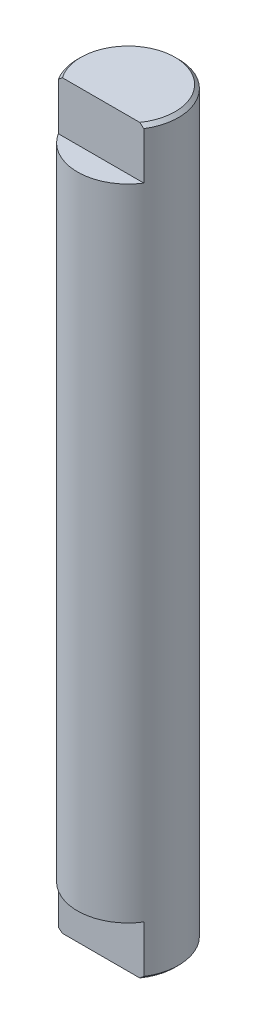
ISO-10303-21;
HEADER;
FILE_DESCRIPTION(('STEP AP214'),'2;1');
FILE_NAME('part.step','',(''),(''),'','','');
FILE_SCHEMA(('AUTOMOTIVE_DESIGN { 1 0 10303 214 1 1 1 1 }'));
ENDSEC;
DATA;
#1=APPLICATION_CONTEXT('core data for automotive mechanical design processes');
#2=APPLICATION_PROTOCOL_DEFINITION('international standard','automotive_design',2000,#1);
#3=PRODUCT_CONTEXT('',#1,'mechanical');
#4=PRODUCT('Part','Part','',(#3));
#5=PRODUCT_RELATED_PRODUCT_CATEGORY('part','',(#4));
#6=PRODUCT_DEFINITION_FORMATION('','',#4);
#7=PRODUCT_DEFINITION_CONTEXT('part definition',#1,'design');
#8=PRODUCT_DEFINITION('design','',#6,#7);
#9=PRODUCT_DEFINITION_SHAPE('','',#8);
#10=(LENGTH_UNIT() NAMED_UNIT(*) SI_UNIT(.MILLI.,.METRE.));
#11=(NAMED_UNIT(*) PLANE_ANGLE_UNIT() SI_UNIT($,.RADIAN.));
#12=(NAMED_UNIT(*) SI_UNIT($,.STERADIAN.) SOLID_ANGLE_UNIT());
#13=UNCERTAINTY_MEASURE_WITH_UNIT(LENGTH_MEASURE(1.E-05),#10,'distance_accuracy_value','');
#14=(GEOMETRIC_REPRESENTATION_CONTEXT(3) GLOBAL_UNCERTAINTY_ASSIGNED_CONTEXT((#13)) GLOBAL_UNIT_ASSIGNED_CONTEXT((#10,
#11,#12)) REPRESENTATION_CONTEXT('',''));
#15=CARTESIAN_POINT('',(0.,0.,0.));
#16=DIRECTION('',(0.,0.,1.));
#17=DIRECTION('',(1.,0.,0.));
#18=AXIS2_PLACEMENT_3D('',#15,#16,#17);
#19=CARTESIAN_POINT('',(21.7578079285504,8.6872644172597,10.3999999999786));
#20=DIRECTION('',(0.,-1.,0.));
#21=DIRECTION('',(0.,0.,-1.));
#22=AXIS2_PLACEMENT_3D('',#19,#20,#21);
#23=CYLINDRICAL_SURFACE('',#22,1.5);
#24=DIRECTION('',(0.,-1.,0.));
#25=VECTOR('',#24,1.);
#26=CARTESIAN_POINT('',(23.0266656825954,-11.8127355827403,11.1999999999786));
#27=LINE('',#26,#25);
#28=CARTESIAN_POINT('',(23.0266656825954,-11.8127355827403,11.1999999999786));
#29=VERTEX_POINT('',#28);
#30=CARTESIAN_POINT('',(23.0266656825954,-13.2127355826565,11.1999999999786));
#31=VERTEX_POINT('',#30);
#32=EDGE_CURVE('E91',#29,#31,#27,.T.);
#33=ORIENTED_EDGE('',*,*,#32,.T.);
#34=CARTESIAN_POINT('',(21.7578079285504,-13.2127355826565,10.3999999999786));
#35=DIRECTION('',(0.,-1.,0.));
#36=DIRECTION('',(0.,0.,-1.));
#37=AXIS2_PLACEMENT_3D('',#34,#35,#36);
#38=CIRCLE('',#37,1.5);
#39=CARTESIAN_POINT('',(20.4889501745055,-13.2127355826565,11.1999999999786));
#40=VERTEX_POINT('',#39);
#41=EDGE_CURVE('E11',#31,#40,#38,.F.);
#42=ORIENTED_EDGE('',*,*,#41,.T.);
#43=DIRECTION('',(0.,-1.,0.));
#44=VECTOR('',#43,1.);
#45=CARTESIAN_POINT('',(20.4889501745055,-11.8127355827403,11.1999999999786));
#46=LINE('',#45,#44);
#47=CARTESIAN_POINT('',(20.4889501745055,-11.8127355827403,11.1999999999786));
#48=VERTEX_POINT('',#47);
#49=EDGE_CURVE('E89',#48,#40,#46,.T.);
#50=ORIENTED_EDGE('',*,*,#49,.F.);
#51=CARTESIAN_POINT('',(21.7578079285504,-11.8127355827403,10.3999999999786));
#52=DIRECTION('',(0.,-1.,0.));
#53=DIRECTION('',(0.,0.,-1.));
#54=AXIS2_PLACEMENT_3D('',#51,#52,#53);
#55=CIRCLE('',#54,1.5);
#56=EDGE_CURVE('E82',#29,#48,#55,.T.);
#57=ORIENTED_EDGE('',*,*,#56,.F.);
#58=EDGE_LOOP('',(#33,#42,#50,#57));
#59=FACE_BOUND('',#58,.T.);
#60=DIRECTION('',(0.,1.,0.));
#61=VECTOR('',#60,1.);
#62=CARTESIAN_POINT('',(20.4889501745055,7.1872644172597,11.1999999999786));
#63=LINE('',#62,#61);
#64=CARTESIAN_POINT('',(20.4889501745055,7.1872644172597,11.1999999999786));
#65=VERTEX_POINT('',#64);
#66=CARTESIAN_POINT('',(20.4889501745055,8.58726441724223,11.1999999999786));
#67=VERTEX_POINT('',#66);
#68=EDGE_CURVE('E107',#65,#67,#63,.T.);
#69=ORIENTED_EDGE('',*,*,#68,.T.);
#70=CARTESIAN_POINT('',(21.7578079285504,8.58726441724223,10.3999999999786));
#71=DIRECTION('',(0.,1.,0.));
#72=DIRECTION('',(0.,0.,1.));
#73=AXIS2_PLACEMENT_3D('',#70,#71,#72);
#74=CIRCLE('',#73,1.5);
#75=CARTESIAN_POINT('',(23.0266656825954,8.58726441724223,11.1999999999786));
#76=VERTEX_POINT('',#75);
#77=EDGE_CURVE('E110',#67,#76,#74,.F.);
#78=ORIENTED_EDGE('',*,*,#77,.T.);
#79=DIRECTION('',(0.,1.,0.));
#80=VECTOR('',#79,1.);
#81=CARTESIAN_POINT('',(23.0266656825954,7.1872644172597,11.1999999999786));
#82=LINE('',#81,#80);
#83=CARTESIAN_POINT('',(23.0266656825954,7.1872644172597,11.1999999999786));
#84=VERTEX_POINT('',#83);
#85=EDGE_CURVE('E104',#84,#76,#82,.T.);
#86=ORIENTED_EDGE('',*,*,#85,.F.);
#87=CARTESIAN_POINT('',(21.7578079285504,7.1872644172597,10.3999999999786));
#88=DIRECTION('',(0.,1.,0.));
#89=DIRECTION('',(0.,0.,1.));
#90=AXIS2_PLACEMENT_3D('',#87,#88,#89);
#91=CIRCLE('',#90,1.5);
#92=EDGE_CURVE('E99',#65,#84,#91,.T.);
#93=ORIENTED_EDGE('',*,*,#92,.F.);
#94=EDGE_LOOP('',(#69,#78,#86,#93));
#95=FACE_BOUND('',#94,.T.);
#96=ADVANCED_FACE('F30',(#59,#95),#23,.T.);
#97=CARTESIAN_POINT('',(23.2578079285504,8.6872644172597,10.3999999999786));
#98=DIRECTION('',(0.,1.,0.));
#99=DIRECTION('',(0.,0.,1.));
#100=AXIS2_PLACEMENT_3D('',#97,#98,#99);
#101=PLANE('',#100);
#102=DIRECTION('',(-1.,0.,0.));
#103=VECTOR('',#102,1.);
#104=CARTESIAN_POINT('',(23.0266656825954,8.6872644172597,11.1999999999786));
#105=LINE('',#104,#103);
#106=CARTESIAN_POINT('',(22.9067204578368,8.6872644172597,11.1999999999786));
#107=VERTEX_POINT('',#106);
#108=CARTESIAN_POINT('',(20.6088953992641,8.6872644172597,11.1999999999786));
#109=VERTEX_POINT('',#108);
#110=EDGE_CURVE('E95',#107,#109,#105,.T.);
#111=ORIENTED_EDGE('',*,*,#110,.F.);
#112=CARTESIAN_POINT('',(21.7578079285504,8.6872644172597,10.3999999999786));
#113=DIRECTION('',(0.,1.,0.));
#114=DIRECTION('',(0.,0.,1.));
#115=AXIS2_PLACEMENT_3D('',#112,#113,#114);
#116=CIRCLE('',#115,1.39999999998253);
#117=EDGE_CURVE('E215',#107,#109,#116,.T.);
#118=ORIENTED_EDGE('',*,*,#117,.T.);
#119=EDGE_LOOP('',(#111,#118));
#120=FACE_BOUND('',#119,.T.);
#121=ADVANCED_FACE('F141',(#120),#101,.T.);
#122=CARTESIAN_POINT('',(21.7578079285504,-13.3127355827403,10.3999999999786));
#123=DIRECTION('',(0.,-1.,0.));
#124=DIRECTION('',(0.,0.,-1.));
#125=AXIS2_PLACEMENT_3D('',#122,#123,#124);
#126=PLANE('',#125);
#127=DIRECTION('',(1.,0.,0.));
#128=VECTOR('',#127,1.);
#129=CARTESIAN_POINT('',(20.4889501745055,-13.3127355827403,11.1999999999786));
#130=LINE('',#129,#128);
#131=CARTESIAN_POINT('',(20.6088953992757,-13.3127355827403,11.1999999999786));
#132=VERTEX_POINT('',#131);
#133=CARTESIAN_POINT('',(22.9067204578252,-13.3127355827403,11.1999999999786));
#134=VERTEX_POINT('',#133);
#135=EDGE_CURVE('E86',#132,#134,#130,.T.);
#136=ORIENTED_EDGE('',*,*,#135,.F.);
#137=CARTESIAN_POINT('',(21.7578079285504,-13.3127355827403,10.3999999999786));
#138=DIRECTION('',(0.,-1.,0.));
#139=DIRECTION('',(0.,0.,-1.));
#140=AXIS2_PLACEMENT_3D('',#137,#138,#139);
#141=CIRCLE('',#140,1.39999999997304);
#142=EDGE_CURVE('E212',#132,#134,#141,.T.);
#143=ORIENTED_EDGE('',*,*,#142,.T.);
#144=EDGE_LOOP('',(#136,#143));
#145=FACE_BOUND('',#144,.T.);
#146=ADVANCED_FACE('F135',(#145),#126,.T.);
#147=CARTESIAN_POINT('',(23.0266656825954,7.1872644172597,11.1999999999786));
#148=DIRECTION('',(0.,0.,-1.));
#149=DIRECTION('',(-1.,0.,0.));
#150=AXIS2_PLACEMENT_3D('',#147,#148,#149);
#151=PLANE('',#150);
#152=ORIENTED_EDGE('',*,*,#85,.T.);
#153=CARTESIAN_POINT('',(23.0266656825954,8.58726441724223,11.1999999999786));
#154=CARTESIAN_POINT('',(23.0067988257606,8.60407981333087,11.1999999999786));
#155=CARTESIAN_POINT('',(22.9868699667476,8.62082084076762,11.1999999999786));
#156=CARTESIAN_POINT('',(22.9468882252797,8.65415417424878,11.1999999999786));
#157=CARTESIAN_POINT('',(22.9268353427066,8.67074648015118,11.1999999999786));
#158=CARTESIAN_POINT('',(22.9067204578368,8.6872644172597,11.1999999999786));
#159=B_SPLINE_CURVE_WITH_KNOTS('',3,(#153,#154,#155,#156,#157,#158),.UNSPECIFIED.,.F.,.F.,(4,2,
4),(0.,0.0780819620066894,0.156163998557068),.UNSPECIFIED.);
#160=EDGE_CURVE('E121',#76,#107,#159,.T.);
#161=ORIENTED_EDGE('',*,*,#160,.T.);
#162=ORIENTED_EDGE('',*,*,#110,.T.);
#163=CARTESIAN_POINT('',(20.6088953992641,8.6872644172597,11.1999999999786));
#164=CARTESIAN_POINT('',(20.5887805143943,8.67074648015118,11.1999999999786));
#165=CARTESIAN_POINT('',(20.5687276318211,8.65415417424878,11.1999999999786));
#166=CARTESIAN_POINT('',(20.5287458903533,8.62082084076762,11.1999999999786));
#167=CARTESIAN_POINT('',(20.5088170313402,8.60407981333087,11.1999999999786));
#168=CARTESIAN_POINT('',(20.4889501745055,8.58726441724223,11.1999999999786));
#169=B_SPLINE_CURVE_WITH_KNOTS('',3,(#163,#164,#165,#166,#167,#168),.UNSPECIFIED.,.F.,.F.,(4,2,
4),(0.,0.0780820365503797,0.156163998557069),.UNSPECIFIED.);
#170=EDGE_CURVE('E115',#109,#67,#169,.T.);
#171=ORIENTED_EDGE('',*,*,#170,.T.);
#172=ORIENTED_EDGE('',*,*,#68,.F.);
#173=DIRECTION('',(-1.,0.,0.));
#174=VECTOR('',#173,1.);
#175=CARTESIAN_POINT('',(23.0266656825954,7.1872644172597,11.1999999999786));
#176=LINE('',#175,#174);
#177=EDGE_CURVE('E101',#84,#65,#176,.T.);
#178=ORIENTED_EDGE('',*,*,#177,.F.);
#179=EDGE_LOOP('',(#152,#161,#162,#171,#172,#178));
#180=FACE_BOUND('',#179,.T.);
#181=ADVANCED_FACE('F129',(#180),#151,.F.);
#182=CARTESIAN_POINT('',(21.7578079285504,7.1872644172597,10.3999999999786));
#183=DIRECTION('',(0.,1.,0.));
#184=DIRECTION('',(0.,0.,1.));
#185=AXIS2_PLACEMENT_3D('',#182,#183,#184);
#186=PLANE('',#185);
#187=ORIENTED_EDGE('',*,*,#92,.T.);
#188=ORIENTED_EDGE('',*,*,#177,.T.);
#189=EDGE_LOOP('',(#187,#188));
#190=FACE_BOUND('',#189,.T.);
#191=ADVANCED_FACE('F134',(#190),#186,.T.);
#192=CARTESIAN_POINT('',(20.4889501745055,-11.8127355827403,11.1999999999786));
#193=DIRECTION('',(0.,0.,-1.));
#194=DIRECTION('',(-1.,0.,0.));
#195=AXIS2_PLACEMENT_3D('',#192,#193,#194);
#196=PLANE('',#195);
#197=ORIENTED_EDGE('',*,*,#135,.T.);
#198=CARTESIAN_POINT('',(22.9067204578252,-13.3127355827403,11.1999999999786));
#199=CARTESIAN_POINT('',(22.9268353426971,-13.2962176456208,11.1999999999786));
#200=CARTESIAN_POINT('',(22.9468882252722,-13.2796253397073,11.1999999999786));
#201=CARTESIAN_POINT('',(22.9868699667439,-13.2462920062041,11.1999999999786));
#202=CARTESIAN_POINT('',(23.0067988257588,-13.2295509787562,11.1999999999786));
#203=CARTESIAN_POINT('',(23.0266656825954,-13.2127355826565,11.1999999999786));
#204=B_SPLINE_CURVE_WITH_KNOTS('',3,(#198,#199,#200,#201,#202,#203),.UNSPECIFIED.,.F.,.F.,(4,2,
4),(0.,0.0780820365760565,0.156163998608428),.UNSPECIFIED.);
#205=EDGE_CURVE('E39',#134,#31,#204,.T.);
#206=ORIENTED_EDGE('',*,*,#205,.T.);
#207=ORIENTED_EDGE('',*,*,#32,.F.);
#208=DIRECTION('',(1.,0.,0.));
#209=VECTOR('',#208,1.);
#210=CARTESIAN_POINT('',(20.4889501745055,-11.8127355827403,11.1999999999786));
#211=LINE('',#210,#209);
#212=EDGE_CURVE('E85',#48,#29,#211,.T.);
#213=ORIENTED_EDGE('',*,*,#212,.F.);
#214=ORIENTED_EDGE('',*,*,#49,.T.);
#215=CARTESIAN_POINT('',(20.4889501745055,-13.2127355826565,11.1999999999786));
#216=CARTESIAN_POINT('',(20.508817031342,-13.2295509787562,11.1999999999786));
#217=CARTESIAN_POINT('',(20.528745890357,-13.2462920062041,11.1999999999786));
#218=CARTESIAN_POINT('',(20.5687276318287,-13.2796253397073,11.1999999999786));
#219=CARTESIAN_POINT('',(20.5887805144038,-13.2962176456208,11.1999999999786));
#220=CARTESIAN_POINT('',(20.6088953992757,-13.3127355827403,11.1999999999786));
#221=B_SPLINE_CURVE_WITH_KNOTS('',3,(#215,#216,#217,#218,#219,#220),.UNSPECIFIED.,.F.,.F.,(4,2,
4),(0.,0.0780819620323715,0.156163998608428),.UNSPECIFIED.);
#222=EDGE_CURVE('E210',#40,#132,#221,.T.);
#223=ORIENTED_EDGE('',*,*,#222,.T.);
#224=EDGE_LOOP('',(#197,#206,#207,#213,#214,#223));
#225=FACE_BOUND('',#224,.T.);
#226=ADVANCED_FACE('F88',(#225),#196,.F.);
#227=CARTESIAN_POINT('',(21.7578079285504,-11.8127355827403,10.3999999999786));
#228=DIRECTION('',(0.,-1.,0.));
#229=DIRECTION('',(0.,0.,-1.));
#230=AXIS2_PLACEMENT_3D('',#227,#228,#229);
#231=PLANE('',#230);
#232=ORIENTED_EDGE('',*,*,#56,.T.);
#233=ORIENTED_EDGE('',*,*,#212,.T.);
#234=EDGE_LOOP('',(#232,#233));
#235=FACE_BOUND('',#234,.T.);
#236=ADVANCED_FACE('F84',(#235),#231,.T.);
#237=CARTESIAN_POINT('',(21.7578079285504,8.58726441724223,10.3999999999786));
#238=DIRECTION('',(0.,-1.,0.));
#239=DIRECTION('',(0.,0.,-1.));
#240=AXIS2_PLACEMENT_3D('',#237,#238,#239);
#241=CONICAL_SURFACE('',#240,1.5,0.785398163397457);
#242=ORIENTED_EDGE('',*,*,#170,.F.);
#243=ORIENTED_EDGE('',*,*,#117,.F.);
#244=ORIENTED_EDGE('',*,*,#160,.F.);
#245=ORIENTED_EDGE('',*,*,#77,.F.);
#246=EDGE_LOOP('',(#242,#243,#244,#245));
#247=FACE_BOUND('',#246,.T.);
#248=ADVANCED_FACE('F126',(#247),#241,.T.);
#249=CARTESIAN_POINT('',(21.7578079285504,-13.3127355827403,10.3999999999786));
#250=DIRECTION('',(0.,1.,0.));
#251=DIRECTION('',(0.,0.,1.));
#252=AXIS2_PLACEMENT_3D('',#249,#250,#251);
#253=CONICAL_SURFACE('',#252,1.39999999997304,0.785398163113231);
#254=ORIENTED_EDGE('',*,*,#222,.F.);
#255=ORIENTED_EDGE('',*,*,#41,.F.);
#256=ORIENTED_EDGE('',*,*,#205,.F.);
#257=ORIENTED_EDGE('',*,*,#142,.F.);
#258=EDGE_LOOP('',(#254,#255,#256,#257));
#259=FACE_BOUND('',#258,.T.);
#260=ADVANCED_FACE('F32',(#259),#253,.T.);
#261=CLOSED_SHELL('',(#96,#121,#146,#181,#191,#226,#236,#248,#260));
#262=MANIFOLD_SOLID_BREP('B2',#261);
#263=ADVANCED_BREP_SHAPE_REPRESENTATION('',(#18,#262),#14);
#264=SHAPE_DEFINITION_REPRESENTATION(#9,#263);
ENDSEC;
END-ISO-10303-21;
